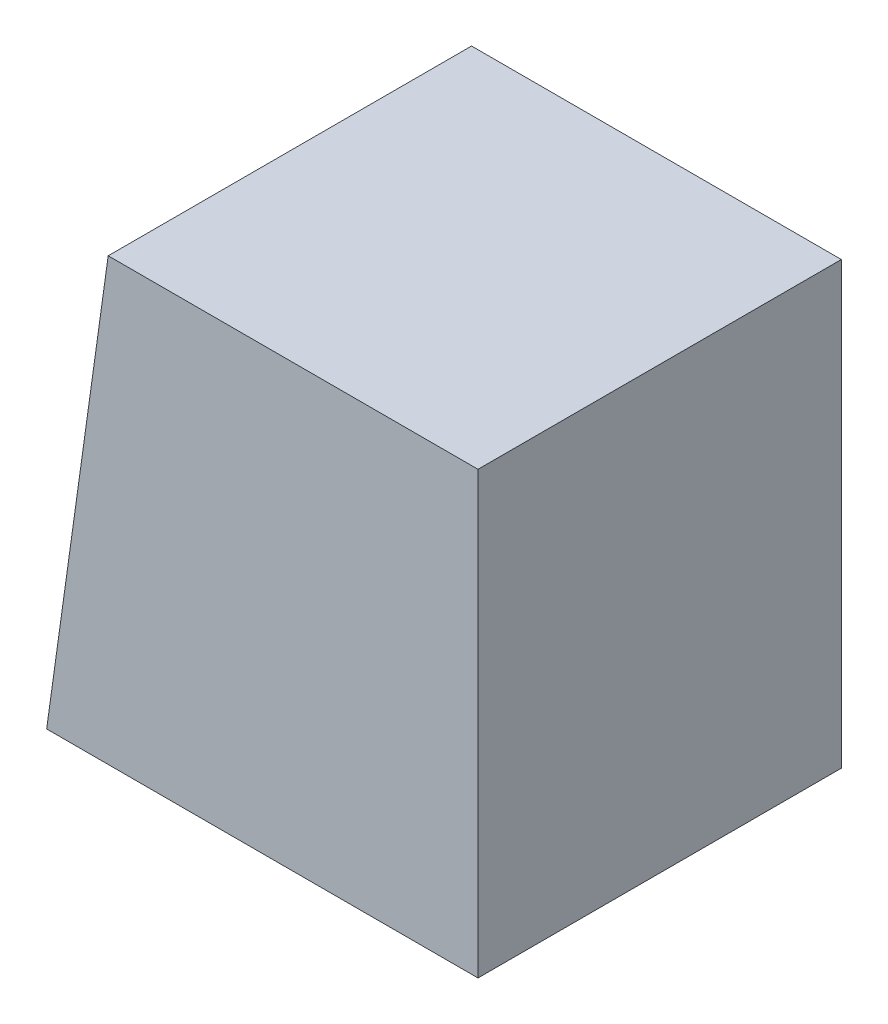
ISO-10303-21;
HEADER;
FILE_DESCRIPTION(('STEP AP214'),'2;1');
FILE_NAME('part.step','',(''),(''),'','','');
FILE_SCHEMA(('AUTOMOTIVE_DESIGN { 1 0 10303 214 1 1 1 1 }'));
ENDSEC;
DATA;
#1=APPLICATION_CONTEXT('core data for automotive mechanical design processes');
#2=APPLICATION_PROTOCOL_DEFINITION('international standard','automotive_design',2000,#1);
#3=PRODUCT_CONTEXT('',#1,'mechanical');
#4=PRODUCT('Part','Part','',(#3));
#5=PRODUCT_RELATED_PRODUCT_CATEGORY('part','',(#4));
#6=PRODUCT_DEFINITION_FORMATION('','',#4);
#7=PRODUCT_DEFINITION_CONTEXT('part definition',#1,'design');
#8=PRODUCT_DEFINITION('design','',#6,#7);
#9=PRODUCT_DEFINITION_SHAPE('','',#8);
#10=(LENGTH_UNIT() NAMED_UNIT(*) SI_UNIT(.MILLI.,.METRE.));
#11=(NAMED_UNIT(*) PLANE_ANGLE_UNIT() SI_UNIT($,.RADIAN.));
#12=(NAMED_UNIT(*) SI_UNIT($,.STERADIAN.) SOLID_ANGLE_UNIT());
#13=UNCERTAINTY_MEASURE_WITH_UNIT(LENGTH_MEASURE(1.E-05),#10,'distance_accuracy_value','');
#14=(GEOMETRIC_REPRESENTATION_CONTEXT(3) GLOBAL_UNCERTAINTY_ASSIGNED_CONTEXT((#13)) GLOBAL_UNIT_ASSIGNED_CONTEXT((#10,
#11,#12)) REPRESENTATION_CONTEXT('',''));
#15=CARTESIAN_POINT('',(0.,0.,0.));
#16=DIRECTION('',(0.,0.,1.));
#17=DIRECTION('',(1.,0.,0.));
#18=AXIS2_PLACEMENT_3D('',#15,#16,#17);
#19=CARTESIAN_POINT('',(1.11022302462516E-13,0.,508.));
#20=DIRECTION('',(0.,0.,1.));
#21=DIRECTION('',(1.,0.,0.));
#22=AXIS2_PLACEMENT_3D('',#19,#20,#21);
#23=PLANE('',#22);
#24=DIRECTION('',(-1.,0.,0.));
#25=VECTOR('',#24,1.);
#26=CARTESIAN_POINT('',(-269.360988073372,307.975,508.));
#27=LINE('',#26,#25);
#28=CARTESIAN_POINT('',(247.65,307.975,508.));
#29=VERTEX_POINT('',#28);
#30=CARTESIAN_POINT('',(-269.360988073372,307.975,508.));
#31=VERTEX_POINT('',#30);
#32=EDGE_CURVE('E64',#29,#31,#27,.T.);
#33=ORIENTED_EDGE('',*,*,#32,.T.);
#34=DIRECTION('',(-0.138341293941713,-0.990384615384615,0.));
#35=VECTOR('',#34,1.);
#36=CARTESIAN_POINT('',(-355.399602445735,-307.975,508.));
#37=LINE('',#36,#35);
#38=CARTESIAN_POINT('',(-355.399602445735,-307.975,508.));
#39=VERTEX_POINT('',#38);
#40=EDGE_CURVE('E128',#31,#39,#37,.T.);
#41=ORIENTED_EDGE('',*,*,#40,.T.);
#42=DIRECTION('',(1.,0.,0.));
#43=VECTOR('',#42,1.);
#44=CARTESIAN_POINT('',(247.65,-307.975,508.));
#45=LINE('',#44,#43);
#46=CARTESIAN_POINT('',(247.65,-307.975,508.));
#47=VERTEX_POINT('',#46);
#48=EDGE_CURVE('E153',#39,#47,#45,.T.);
#49=ORIENTED_EDGE('',*,*,#48,.T.);
#50=DIRECTION('',(0.,1.,0.));
#51=VECTOR('',#50,1.);
#52=CARTESIAN_POINT('',(247.65,307.975,508.));
#53=LINE('',#52,#51);
#54=EDGE_CURVE('E106',#47,#29,#53,.T.);
#55=ORIENTED_EDGE('',*,*,#54,.T.);
#56=EDGE_LOOP('',(#33,#41,#49,#55));
#57=FACE_BOUND('',#56,.T.);
#58=ADVANCED_FACE('F60',(#57),#23,.T.);
#59=CARTESIAN_POINT('',(0.,0.,0.));
#60=DIRECTION('',(0.,0.,1.));
#61=DIRECTION('',(1.,0.,0.));
#62=AXIS2_PLACEMENT_3D('',#59,#60,#61);
#63=PLANE('',#62);
#64=DIRECTION('',(1.,0.,0.));
#65=VECTOR('',#64,1.);
#66=CARTESIAN_POINT('',(247.65,-307.975,0.));
#67=LINE('',#66,#65);
#68=CARTESIAN_POINT('',(-355.399602445735,-307.975,0.));
#69=VERTEX_POINT('',#68);
#70=CARTESIAN_POINT('',(247.65,-307.975,0.));
#71=VERTEX_POINT('',#70);
#72=EDGE_CURVE('E114',#69,#71,#67,.T.);
#73=ORIENTED_EDGE('',*,*,#72,.F.);
#74=DIRECTION('',(-0.138341293941713,-0.990384615384615,0.));
#75=VECTOR('',#74,1.);
#76=CARTESIAN_POINT('',(-355.399602445735,-307.975,0.));
#77=LINE('',#76,#75);
#78=CARTESIAN_POINT('',(-269.360988073372,307.975,0.));
#79=VERTEX_POINT('',#78);
#80=EDGE_CURVE('E137',#79,#69,#77,.T.);
#81=ORIENTED_EDGE('',*,*,#80,.F.);
#82=DIRECTION('',(-1.,0.,0.));
#83=VECTOR('',#82,1.);
#84=CARTESIAN_POINT('',(-269.360988073372,307.975,0.));
#85=LINE('',#84,#83);
#86=CARTESIAN_POINT('',(247.65,307.975,0.));
#87=VERTEX_POINT('',#86);
#88=EDGE_CURVE('E11',#87,#79,#85,.T.);
#89=ORIENTED_EDGE('',*,*,#88,.F.);
#90=DIRECTION('',(0.,1.,0.));
#91=VECTOR('',#90,1.);
#92=CARTESIAN_POINT('',(247.65,307.975,0.));
#93=LINE('',#92,#91);
#94=EDGE_CURVE('E146',#71,#87,#93,.T.);
#95=ORIENTED_EDGE('',*,*,#94,.F.);
#96=EDGE_LOOP('',(#73,#81,#89,#95));
#97=FACE_BOUND('',#96,.T.);
#98=ADVANCED_FACE('F62',(#97),#63,.F.);
#99=CARTESIAN_POINT('',(-269.360988073372,307.975,1370.01115161578));
#100=DIRECTION('',(0.,-1.,0.));
#101=DIRECTION('',(0.,0.,-1.));
#102=AXIS2_PLACEMENT_3D('',#99,#100,#101);
#103=PLANE('',#102);
#104=ORIENTED_EDGE('',*,*,#32,.F.);
#105=DIRECTION('',(0.,0.,-1.));
#106=VECTOR('',#105,1.);
#107=CARTESIAN_POINT('',(247.65,307.975,1370.01115161578));
#108=LINE('',#107,#106);
#109=EDGE_CURVE('E130',#29,#87,#108,.T.);
#110=ORIENTED_EDGE('',*,*,#109,.T.);
#111=ORIENTED_EDGE('',*,*,#88,.T.);
#112=DIRECTION('',(0.,0.,-1.));
#113=VECTOR('',#112,1.);
#114=CARTESIAN_POINT('',(-269.360988073372,307.975,1370.01115161578));
#115=LINE('',#114,#113);
#116=EDGE_CURVE('E132',#31,#79,#115,.T.);
#117=ORIENTED_EDGE('',*,*,#116,.F.);
#118=EDGE_LOOP('',(#104,#110,#111,#117));
#119=FACE_BOUND('',#118,.T.);
#120=ADVANCED_FACE('F133',(#119),#103,.F.);
#121=CARTESIAN_POINT('',(247.65,307.975,1370.01115161578));
#122=DIRECTION('',(-1.,0.,0.));
#123=DIRECTION('',(0.,0.,1.));
#124=AXIS2_PLACEMENT_3D('',#121,#122,#123);
#125=PLANE('',#124);
#126=ORIENTED_EDGE('',*,*,#54,.F.);
#127=DIRECTION('',(0.,0.,-1.));
#128=VECTOR('',#127,1.);
#129=CARTESIAN_POINT('',(247.65,-307.975,1370.01115161578));
#130=LINE('',#129,#128);
#131=EDGE_CURVE('E152',#47,#71,#130,.T.);
#132=ORIENTED_EDGE('',*,*,#131,.T.);
#133=ORIENTED_EDGE('',*,*,#94,.T.);
#134=ORIENTED_EDGE('',*,*,#109,.F.);
#135=EDGE_LOOP('',(#126,#132,#133,#134));
#136=FACE_BOUND('',#135,.T.);
#137=ADVANCED_FACE('F165',(#136),#125,.F.);
#138=CARTESIAN_POINT('',(247.65,-307.975,1370.01115161578));
#139=DIRECTION('',(0.,1.,0.));
#140=DIRECTION('',(1.,0.,0.));
#141=AXIS2_PLACEMENT_3D('',#138,#139,#140);
#142=PLANE('',#141);
#143=ORIENTED_EDGE('',*,*,#48,.F.);
#144=DIRECTION('',(0.,0.,-1.));
#145=VECTOR('',#144,1.);
#146=CARTESIAN_POINT('',(-355.399602445735,-307.975,1370.01115161578));
#147=LINE('',#146,#145);
#148=EDGE_CURVE('E141',#39,#69,#147,.T.);
#149=ORIENTED_EDGE('',*,*,#148,.T.);
#150=ORIENTED_EDGE('',*,*,#72,.T.);
#151=ORIENTED_EDGE('',*,*,#131,.F.);
#152=EDGE_LOOP('',(#143,#149,#150,#151));
#153=FACE_BOUND('',#152,.T.);
#154=ADVANCED_FACE('F180',(#153),#142,.F.);
#155=CARTESIAN_POINT('',(-355.399602445735,-307.975,1370.01115161578));
#156=DIRECTION('',(0.990384615384615,-0.138341293941713,0.));
#157=DIRECTION('',(0.,0.,-1.));
#158=AXIS2_PLACEMENT_3D('',#155,#156,#157);
#159=PLANE('',#158);
#160=ORIENTED_EDGE('',*,*,#40,.F.);
#161=ORIENTED_EDGE('',*,*,#116,.T.);
#162=ORIENTED_EDGE('',*,*,#80,.T.);
#163=ORIENTED_EDGE('',*,*,#148,.F.);
#164=EDGE_LOOP('',(#160,#161,#162,#163));
#165=FACE_BOUND('',#164,.T.);
#166=ADVANCED_FACE('F140',(#165),#159,.F.);
#167=CLOSED_SHELL('',(#58,#98,#120,#137,#154,#166));
#168=MANIFOLD_SOLID_BREP('B2',#167);
#169=ADVANCED_BREP_SHAPE_REPRESENTATION('',(#18,#168),#14);
#170=SHAPE_DEFINITION_REPRESENTATION(#9,#169);
ENDSEC;
END-ISO-10303-21;
